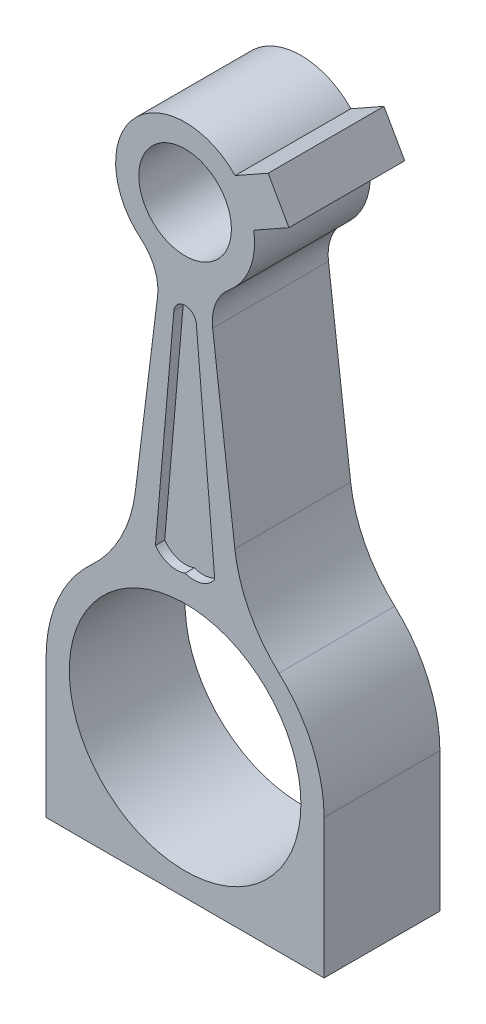
ISO-10303-21;
HEADER;
FILE_DESCRIPTION(('STEP AP214'),'2;1');
FILE_NAME('part.step','',(''),(''),'','','');
FILE_SCHEMA(('AUTOMOTIVE_DESIGN { 1 0 10303 214 1 1 1 1 }'));
ENDSEC;
DATA;
#1=APPLICATION_CONTEXT('core data for automotive mechanical design processes');
#2=APPLICATION_PROTOCOL_DEFINITION('international standard','automotive_design',2000,#1);
#3=PRODUCT_CONTEXT('',#1,'mechanical');
#4=PRODUCT('Part','Part','',(#3));
#5=PRODUCT_RELATED_PRODUCT_CATEGORY('part','',(#4));
#6=PRODUCT_DEFINITION_FORMATION('','',#4);
#7=PRODUCT_DEFINITION_CONTEXT('part definition',#1,'design');
#8=PRODUCT_DEFINITION('design','',#6,#7);
#9=PRODUCT_DEFINITION_SHAPE('','',#8);
#10=(LENGTH_UNIT() NAMED_UNIT(*) SI_UNIT(.MILLI.,.METRE.));
#11=(NAMED_UNIT(*) PLANE_ANGLE_UNIT() SI_UNIT($,.RADIAN.));
#12=(NAMED_UNIT(*) SI_UNIT($,.STERADIAN.) SOLID_ANGLE_UNIT());
#13=UNCERTAINTY_MEASURE_WITH_UNIT(LENGTH_MEASURE(1.E-05),#10,'distance_accuracy_value','');
#14=(GEOMETRIC_REPRESENTATION_CONTEXT(3) GLOBAL_UNCERTAINTY_ASSIGNED_CONTEXT((#13)) GLOBAL_UNIT_ASSIGNED_CONTEXT((#10,
#11,#12)) REPRESENTATION_CONTEXT('',''));
#15=CARTESIAN_POINT('',(0.,0.,0.));
#16=DIRECTION('',(0.,0.,1.));
#17=DIRECTION('',(1.,0.,0.));
#18=AXIS2_PLACEMENT_3D('',#15,#16,#17);
#19=CARTESIAN_POINT('',(-15.8746273797095,80.6868903188695,25.));
#20=DIRECTION('',(0.,0.,1.));
#21=DIRECTION('',(1.,0.,0.));
#22=AXIS2_PLACEMENT_3D('',#19,#20,#21);
#23=PLANE('',#22);
#24=CARTESIAN_POINT('',(0.,78.3083251410441,25.));
#25=DIRECTION('',(0.,0.,1.));
#26=DIRECTION('',(-1.,0.,0.));
#27=AXIS2_PLACEMENT_3D('',#24,#25,#26);
#28=CIRCLE('',#27,2.43314408957335);
#29=CARTESIAN_POINT('',(2.42401891172644,78.5188541799397,25.));
#30=VERTEX_POINT('',#29);
#31=CARTESIAN_POINT('',(-2.42401891172644,78.5188541799397,25.));
#32=VERTEX_POINT('',#31);
#33=EDGE_CURVE('E57',#30,#32,#28,.T.);
#34=ORIENTED_EDGE('',*,*,#33,.F.);
#35=DIRECTION('',(-0.0864803256849415,0.996253558723594,0.));
#36=VECTOR('',#35,1.);
#37=CARTESIAN_POINT('',(2.42401891172644,78.5188541799397,25.));
#38=LINE('',#37,#36);
#39=CARTESIAN_POINT('',(6.40336891240634,32.6767326547846,25.));
#40=VERTEX_POINT('',#39);
#41=EDGE_CURVE('E404',#40,#30,#38,.T.);
#42=ORIENTED_EDGE('',*,*,#41,.F.);
#43=CARTESIAN_POINT('',(1.88165049597591,35.9038191144411,25.));
#44=DIRECTION('',(0.,0.,1.));
#45=DIRECTION('',(-1.,0.,0.));
#46=AXIS2_PLACEMENT_3D('',#43,#44,#45);
#47=CIRCLE('',#46,5.55517996608433);
#48=CARTESIAN_POINT('',(0.,30.6770212547015,25.));
#49=VERTEX_POINT('',#48);
#50=EDGE_CURVE('E409',#49,#40,#47,.T.);
#51=ORIENTED_EDGE('',*,*,#50,.F.);
#52=CARTESIAN_POINT('',(-1.88165049597591,35.9038191144411,25.));
#53=DIRECTION('',(0.,0.,1.));
#54=DIRECTION('',(1.,0.,0.));
#55=AXIS2_PLACEMENT_3D('',#52,#53,#54);
#56=CIRCLE('',#55,5.55517996608433);
#57=CARTESIAN_POINT('',(-6.40336891240634,32.6767326547846,25.));
#58=VERTEX_POINT('',#57);
#59=EDGE_CURVE('E413',#58,#49,#56,.T.);
#60=ORIENTED_EDGE('',*,*,#59,.F.);
#61=DIRECTION('',(-0.0864803256849415,-0.996253558723594,0.));
#62=VECTOR('',#61,1.);
#63=CARTESIAN_POINT('',(-2.42401891172644,78.5188541799397,25.));
#64=LINE('',#63,#62);
#65=EDGE_CURVE('E417',#32,#58,#64,.T.);
#66=ORIENTED_EDGE('',*,*,#65,.F.);
#67=EDGE_LOOP('',(#34,#42,#51,#60,#66));
#68=FACE_BOUND('',#67,.T.);
#69=CARTESIAN_POINT('',(0.,0.,25.));
#70=DIRECTION('',(0.,0.,1.));
#71=DIRECTION('',(1.,0.,0.));
#72=AXIS2_PLACEMENT_3D('',#69,#70,#71);
#73=CIRCLE('',#72,25.);
#74=CARTESIAN_POINT('',(25.,0.,25.));
#75=VERTEX_POINT('',#74);
#76=EDGE_CURVE('E208',#75,#75,#73,.T.);
#77=ORIENTED_EDGE('',*,*,#76,.F.);
#78=EDGE_LOOP('',(#77));
#79=FACE_BOUND('',#78,.T.);
#80=CARTESIAN_POINT('',(-15.8746273797095,80.6868903188695,25.));
#81=DIRECTION('',(0.,0.,-1.));
#82=DIRECTION('',(1.,0.,0.));
#83=AXIS2_PLACEMENT_3D('',#80,#81,#82);
#84=CIRCLE('',#83,10.);
#85=CARTESIAN_POINT('',(-9.52477642782569,88.4121341913217,25.));
#86=VERTEX_POINT('',#85);
#87=CARTESIAN_POINT('',(-5.94956690013108,79.464935132821,25.));
#88=VERTEX_POINT('',#87);
#89=EDGE_CURVE('E251',#86,#88,#84,.T.);
#90=ORIENTED_EDGE('',*,*,#89,.T.);
#91=DIRECTION('',(-0.122195518604848,-0.992506047957841,0.));
#92=VECTOR('',#91,1.);
#93=CARTESIAN_POINT('',(-5.94956690013108,79.464935132821,25.));
#94=LINE('',#93,#92);
#95=CARTESIAN_POINT('',(-10.7353375612273,40.5935724223992,25.));
#96=VERTEX_POINT('',#95);
#97=EDGE_CURVE('E131',#88,#96,#94,.T.);
#98=ORIENTED_EDGE('',*,*,#97,.T.);
#99=CARTESIAN_POINT('',(-40.5105189999625,44.2594379805447,25.));
#100=DIRECTION('',(0.,0.,-1.));
#101=DIRECTION('',(-1.,0.,0.));
#102=AXIS2_PLACEMENT_3D('',#99,#100,#101);
#103=CIRCLE('',#102,30.);
#104=CARTESIAN_POINT('',(-20.2552594999812,22.1297189902723,25.));
#105=VERTEX_POINT('',#104);
#106=EDGE_CURVE('E304',#96,#105,#103,.T.);
#107=ORIENTED_EDGE('',*,*,#106,.T.);
#108=CARTESIAN_POINT('',(0.,0.,25.));
#109=DIRECTION('',(0.,0.,1.));
#110=DIRECTION('',(1.,0.,0.));
#111=AXIS2_PLACEMENT_3D('',#108,#109,#110);
#112=CIRCLE('',#111,30.);
#113=CARTESIAN_POINT('',(-30.,0.,25.));
#114=VERTEX_POINT('',#113);
#115=EDGE_CURVE('E324',#105,#114,#112,.T.);
#116=ORIENTED_EDGE('',*,*,#115,.T.);
#117=DIRECTION('',(0.,-1.,0.));
#118=VECTOR('',#117,1.);
#119=CARTESIAN_POINT('',(-30.,0.,25.));
#120=LINE('',#119,#118);
#121=CARTESIAN_POINT('',(-30.,-30.,25.));
#122=VERTEX_POINT('',#121);
#123=EDGE_CURVE('E320',#114,#122,#120,.T.);
#124=ORIENTED_EDGE('',*,*,#123,.T.);
#125=DIRECTION('',(1.,0.,0.));
#126=VECTOR('',#125,1.);
#127=CARTESIAN_POINT('',(-30.,-30.,25.));
#128=LINE('',#127,#126);
#129=CARTESIAN_POINT('',(30.,-30.,25.));
#130=VERTEX_POINT('',#129);
#131=EDGE_CURVE('E323',#122,#130,#128,.T.);
#132=ORIENTED_EDGE('',*,*,#131,.T.);
#133=DIRECTION('',(0.,1.,0.));
#134=VECTOR('',#133,1.);
#135=CARTESIAN_POINT('',(30.,0.,25.));
#136=LINE('',#135,#134);
#137=CARTESIAN_POINT('',(30.,0.,25.));
#138=VERTEX_POINT('',#137);
#139=EDGE_CURVE('E328',#130,#138,#136,.T.);
#140=ORIENTED_EDGE('',*,*,#139,.T.);
#141=CARTESIAN_POINT('',(0.,0.,25.));
#142=DIRECTION('',(0.,0.,1.));
#143=DIRECTION('',(1.,0.,0.));
#144=AXIS2_PLACEMENT_3D('',#141,#142,#143);
#145=CIRCLE('',#144,30.);
#146=CARTESIAN_POINT('',(20.2552594999812,22.1297189902723,25.));
#147=VERTEX_POINT('',#146);
#148=EDGE_CURVE('E335',#138,#147,#145,.T.);
#149=ORIENTED_EDGE('',*,*,#148,.T.);
#150=CARTESIAN_POINT('',(40.5105189999625,44.2594379805447,25.));
#151=DIRECTION('',(0.,0.,-1.));
#152=DIRECTION('',(1.,0.,0.));
#153=AXIS2_PLACEMENT_3D('',#150,#151,#152);
#154=CIRCLE('',#153,30.);
#155=CARTESIAN_POINT('',(10.7353375612273,40.5935724223992,25.));
#156=VERTEX_POINT('',#155);
#157=EDGE_CURVE('E338',#147,#156,#154,.T.);
#158=ORIENTED_EDGE('',*,*,#157,.T.);
#159=DIRECTION('',(-0.122195518604848,0.992506047957841,0.));
#160=VECTOR('',#159,1.);
#161=CARTESIAN_POINT('',(5.94956690013108,79.464935132821,25.));
#162=LINE('',#161,#160);
#163=CARTESIAN_POINT('',(5.94956690013108,79.464935132821,25.));
#164=VERTEX_POINT('',#163);
#165=EDGE_CURVE('E341',#156,#164,#162,.T.);
#166=ORIENTED_EDGE('',*,*,#165,.T.);
#167=CARTESIAN_POINT('',(15.8746273797095,80.6868903188695,25.));
#168=DIRECTION('',(0.,0.,-1.));
#169=DIRECTION('',(-1.,0.,0.));
#170=AXIS2_PLACEMENT_3D('',#167,#168,#169);
#171=CIRCLE('',#170,10.);
#172=CARTESIAN_POINT('',(9.5247764278257,88.4121341913217,25.));
#173=VERTEX_POINT('',#172);
#174=EDGE_CURVE('E344',#164,#173,#171,.T.);
#175=ORIENTED_EDGE('',*,*,#174,.T.);
#176=CARTESIAN_POINT('',(0.,100.,25.));
#177=DIRECTION('',(0.,0.,1.));
#178=DIRECTION('',(1.,0.,0.));
#179=AXIS2_PLACEMENT_3D('',#176,#177,#178);
#180=CIRCLE('',#179,15.);
#181=CARTESIAN_POINT('',(14.8348774028038,102.219552307062,25.));
#182=VERTEX_POINT('',#181);
#183=EDGE_CURVE('E347',#173,#182,#180,.T.);
#184=ORIENTED_EDGE('',*,*,#183,.T.);
#185=DIRECTION('',(0.871727655672724,0.489990708417349,0.));
#186=VECTOR('',#185,1.);
#187=CARTESIAN_POINT('',(14.8348774028038,102.219552307062,25.));
#188=LINE('',#187,#186);
#189=CARTESIAN_POINT('',(22.4152206320299,106.480398828065,25.));
#190=VERTEX_POINT('',#189);
#191=EDGE_CURVE('E178',#182,#190,#188,.T.);
#192=ORIENTED_EDGE('',*,*,#191,.T.);
#193=DIRECTION('',(-0.491013063369396,0.871152209203766,0.));
#194=VECTOR('',#193,1.);
#195=CARTESIAN_POINT('',(17.9356987556267,114.427937641038,25.));
#196=LINE('',#195,#194);
#197=CARTESIAN_POINT('',(17.9356987556267,114.427937641038,25.));
#198=VERTEX_POINT('',#197);
#199=EDGE_CURVE('E171',#190,#198,#196,.T.);
#200=ORIENTED_EDGE('',*,*,#199,.T.);
#201=DIRECTION('',(-0.871727655672725,-0.489990708417349,0.));
#202=VECTOR('',#201,1.);
#203=CARTESIAN_POINT('',(10.7953655760058,110.414417030271,25.));
#204=LINE('',#203,#202);
#205=CARTESIAN_POINT('',(10.7953655760058,110.414417030271,25.));
#206=VERTEX_POINT('',#205);
#207=EDGE_CURVE('E175',#198,#206,#204,.T.);
#208=ORIENTED_EDGE('',*,*,#207,.T.);
#209=CARTESIAN_POINT('',(0.,100.,25.));
#210=DIRECTION('',(0.,0.,1.));
#211=DIRECTION('',(1.,0.,0.));
#212=AXIS2_PLACEMENT_3D('',#209,#210,#211);
#213=CIRCLE('',#212,15.);
#214=EDGE_CURVE('E66',#206,#86,#213,.T.);
#215=ORIENTED_EDGE('',*,*,#214,.T.);
#216=EDGE_LOOP('',(#90,#98,#107,#116,#124,#132,#140,#149,#158,#166,#175,#184,#192,#200,#208,#215));
#217=FACE_BOUND('',#216,.T.);
#218=CARTESIAN_POINT('',(0.,100.,25.));
#219=DIRECTION('',(0.,0.,1.));
#220=DIRECTION('',(1.,0.,0.));
#221=AXIS2_PLACEMENT_3D('',#218,#219,#220);
#222=CIRCLE('',#221,10.);
#223=CARTESIAN_POINT('',(10.,100.,25.));
#224=VERTEX_POINT('',#223);
#225=EDGE_CURVE('E374',#224,#224,#222,.T.);
#226=ORIENTED_EDGE('',*,*,#225,.F.);
#227=EDGE_LOOP('',(#226));
#228=FACE_BOUND('',#227,.T.);
#229=ADVANCED_FACE('F41',(#68,#79,#217,#228),#23,.T.);
#230=CARTESIAN_POINT('',(-15.8746273797095,80.6868903188695,0.));
#231=DIRECTION('',(0.,0.,1.));
#232=DIRECTION('',(1.,0.,0.));
#233=AXIS2_PLACEMENT_3D('',#230,#231,#232);
#234=PLANE('',#233);
#235=CARTESIAN_POINT('',(-15.8746273797095,80.6868903188695,0.));
#236=DIRECTION('',(0.,0.,-1.));
#237=DIRECTION('',(1.,0.,0.));
#238=AXIS2_PLACEMENT_3D('',#235,#236,#237);
#239=CIRCLE('',#238,10.);
#240=CARTESIAN_POINT('',(-9.52477642782569,88.4121341913217,0.));
#241=VERTEX_POINT('',#240);
#242=CARTESIAN_POINT('',(-5.94956690013108,79.464935132821,0.));
#243=VERTEX_POINT('',#242);
#244=EDGE_CURVE('E203',#241,#243,#239,.T.);
#245=ORIENTED_EDGE('',*,*,#244,.F.);
#246=CARTESIAN_POINT('',(0.,100.,0.));
#247=DIRECTION('',(0.,0.,1.));
#248=DIRECTION('',(1.,0.,0.));
#249=AXIS2_PLACEMENT_3D('',#246,#247,#248);
#250=CIRCLE('',#249,15.);
#251=CARTESIAN_POINT('',(10.7953655760058,110.414417030271,0.));
#252=VERTEX_POINT('',#251);
#253=EDGE_CURVE('E123',#252,#241,#250,.T.);
#254=ORIENTED_EDGE('',*,*,#253,.F.);
#255=DIRECTION('',(-0.871727655672725,-0.489990708417349,0.));
#256=VECTOR('',#255,1.);
#257=CARTESIAN_POINT('',(10.7953655760058,110.414417030271,0.));
#258=LINE('',#257,#256);
#259=CARTESIAN_POINT('',(17.9356987556267,114.427937641038,0.));
#260=VERTEX_POINT('',#259);
#261=EDGE_CURVE('E246',#260,#252,#258,.T.);
#262=ORIENTED_EDGE('',*,*,#261,.F.);
#263=DIRECTION('',(-0.491013063369396,0.871152209203766,0.));
#264=VECTOR('',#263,1.);
#265=CARTESIAN_POINT('',(17.9356987556267,114.427937641038,0.));
#266=LINE('',#265,#264);
#267=CARTESIAN_POINT('',(22.4152206320299,106.480398828065,0.));
#268=VERTEX_POINT('',#267);
#269=EDGE_CURVE('E188',#268,#260,#266,.T.);
#270=ORIENTED_EDGE('',*,*,#269,.F.);
#271=DIRECTION('',(0.871727655672724,0.489990708417349,0.));
#272=VECTOR('',#271,1.);
#273=CARTESIAN_POINT('',(14.8348774028038,102.219552307062,0.));
#274=LINE('',#273,#272);
#275=CARTESIAN_POINT('',(14.8348774028038,102.219552307062,0.));
#276=VERTEX_POINT('',#275);
#277=EDGE_CURVE('E241',#276,#268,#274,.T.);
#278=ORIENTED_EDGE('',*,*,#277,.F.);
#279=CARTESIAN_POINT('',(0.,100.,0.));
#280=DIRECTION('',(0.,0.,1.));
#281=DIRECTION('',(1.,0.,0.));
#282=AXIS2_PLACEMENT_3D('',#279,#280,#281);
#283=CIRCLE('',#282,15.);
#284=CARTESIAN_POINT('',(9.5247764278257,88.4121341913217,0.));
#285=VERTEX_POINT('',#284);
#286=EDGE_CURVE('E238',#285,#276,#283,.T.);
#287=ORIENTED_EDGE('',*,*,#286,.F.);
#288=CARTESIAN_POINT('',(15.8746273797095,80.6868903188695,0.));
#289=DIRECTION('',(0.,0.,-1.));
#290=DIRECTION('',(-1.,0.,0.));
#291=AXIS2_PLACEMENT_3D('',#288,#289,#290);
#292=CIRCLE('',#291,10.);
#293=CARTESIAN_POINT('',(5.94956690013108,79.464935132821,0.));
#294=VERTEX_POINT('',#293);
#295=EDGE_CURVE('E235',#294,#285,#292,.T.);
#296=ORIENTED_EDGE('',*,*,#295,.F.);
#297=DIRECTION('',(-0.122195518604848,0.992506047957841,0.));
#298=VECTOR('',#297,1.);
#299=CARTESIAN_POINT('',(5.94956690013108,79.464935132821,0.));
#300=LINE('',#299,#298);
#301=CARTESIAN_POINT('',(10.7353375612273,40.5935724223992,0.));
#302=VERTEX_POINT('',#301);
#303=EDGE_CURVE('E232',#302,#294,#300,.T.);
#304=ORIENTED_EDGE('',*,*,#303,.F.);
#305=CARTESIAN_POINT('',(40.5105189999625,44.2594379805447,0.));
#306=DIRECTION('',(0.,0.,-1.));
#307=DIRECTION('',(1.,0.,0.));
#308=AXIS2_PLACEMENT_3D('',#305,#306,#307);
#309=CIRCLE('',#308,30.);
#310=CARTESIAN_POINT('',(20.2552594999812,22.1297189902723,0.));
#311=VERTEX_POINT('',#310);
#312=EDGE_CURVE('E229',#311,#302,#309,.T.);
#313=ORIENTED_EDGE('',*,*,#312,.F.);
#314=CARTESIAN_POINT('',(0.,0.,0.));
#315=DIRECTION('',(0.,0.,1.));
#316=DIRECTION('',(1.,0.,0.));
#317=AXIS2_PLACEMENT_3D('',#314,#315,#316);
#318=CIRCLE('',#317,30.);
#319=CARTESIAN_POINT('',(30.,0.,0.));
#320=VERTEX_POINT('',#319);
#321=EDGE_CURVE('E226',#320,#311,#318,.T.);
#322=ORIENTED_EDGE('',*,*,#321,.F.);
#323=DIRECTION('',(0.,1.,0.));
#324=VECTOR('',#323,1.);
#325=CARTESIAN_POINT('',(30.,0.,0.));
#326=LINE('',#325,#324);
#327=CARTESIAN_POINT('',(30.,-30.,0.));
#328=VERTEX_POINT('',#327);
#329=EDGE_CURVE('E223',#328,#320,#326,.T.);
#330=ORIENTED_EDGE('',*,*,#329,.F.);
#331=DIRECTION('',(1.,0.,0.));
#332=VECTOR('',#331,1.);
#333=CARTESIAN_POINT('',(-30.,-30.,0.));
#334=LINE('',#333,#332);
#335=CARTESIAN_POINT('',(-30.,-30.,0.));
#336=VERTEX_POINT('',#335);
#337=EDGE_CURVE('E220',#336,#328,#334,.T.);
#338=ORIENTED_EDGE('',*,*,#337,.F.);
#339=DIRECTION('',(0.,-1.,0.));
#340=VECTOR('',#339,1.);
#341=CARTESIAN_POINT('',(-30.,0.,0.));
#342=LINE('',#341,#340);
#343=CARTESIAN_POINT('',(-30.,0.,0.));
#344=VERTEX_POINT('',#343);
#345=EDGE_CURVE('E217',#344,#336,#342,.T.);
#346=ORIENTED_EDGE('',*,*,#345,.F.);
#347=CARTESIAN_POINT('',(0.,0.,0.));
#348=DIRECTION('',(0.,0.,1.));
#349=DIRECTION('',(1.,0.,0.));
#350=AXIS2_PLACEMENT_3D('',#347,#348,#349);
#351=CIRCLE('',#350,30.);
#352=CARTESIAN_POINT('',(-20.2552594999812,22.1297189902723,0.));
#353=VERTEX_POINT('',#352);
#354=EDGE_CURVE('E214',#353,#344,#351,.T.);
#355=ORIENTED_EDGE('',*,*,#354,.F.);
#356=CARTESIAN_POINT('',(-40.5105189999625,44.2594379805447,0.));
#357=DIRECTION('',(0.,0.,-1.));
#358=DIRECTION('',(-1.,0.,0.));
#359=AXIS2_PLACEMENT_3D('',#356,#357,#358);
#360=CIRCLE('',#359,30.);
#361=CARTESIAN_POINT('',(-10.7353375612273,40.5935724223992,0.));
#362=VERTEX_POINT('',#361);
#363=EDGE_CURVE('E211',#362,#353,#360,.T.);
#364=ORIENTED_EDGE('',*,*,#363,.F.);
#365=DIRECTION('',(-0.122195518604848,-0.992506047957841,0.));
#366=VECTOR('',#365,1.);
#367=CARTESIAN_POINT('',(-5.94956690013108,79.464935132821,0.));
#368=LINE('',#367,#366);
#369=EDGE_CURVE('E207',#243,#362,#368,.T.);
#370=ORIENTED_EDGE('',*,*,#369,.F.);
#371=EDGE_LOOP('',(#245,#254,#262,#270,#278,#287,#296,#304,#313,#322,#330,#338,#346,#355,#364,#370));
#372=FACE_BOUND('',#371,.T.);
#373=CARTESIAN_POINT('',(0.,0.,0.));
#374=DIRECTION('',(0.,0.,1.));
#375=DIRECTION('',(1.,0.,0.));
#376=AXIS2_PLACEMENT_3D('',#373,#374,#375);
#377=CIRCLE('',#376,25.);
#378=CARTESIAN_POINT('',(25.,0.,0.));
#379=VERTEX_POINT('',#378);
#380=EDGE_CURVE('E369',#379,#379,#377,.T.);
#381=ORIENTED_EDGE('',*,*,#380,.T.);
#382=EDGE_LOOP('',(#381));
#383=FACE_BOUND('',#382,.T.);
#384=CARTESIAN_POINT('',(0.,100.,0.));
#385=DIRECTION('',(0.,0.,1.));
#386=DIRECTION('',(1.,0.,0.));
#387=AXIS2_PLACEMENT_3D('',#384,#385,#386);
#388=CIRCLE('',#387,10.);
#389=CARTESIAN_POINT('',(10.,100.,0.));
#390=VERTEX_POINT('',#389);
#391=EDGE_CURVE('E378',#390,#390,#388,.T.);
#392=ORIENTED_EDGE('',*,*,#391,.T.);
#393=EDGE_LOOP('',(#392));
#394=FACE_BOUND('',#393,.T.);
#395=ADVANCED_FACE('F308',(#372,#383,#394),#234,.F.);
#396=CARTESIAN_POINT('',(-15.8746273797095,80.6868903188695,25.));
#397=DIRECTION('',(0.,0.,-1.));
#398=DIRECTION('',(-1.,0.,0.));
#399=AXIS2_PLACEMENT_3D('',#396,#397,#398);
#400=CYLINDRICAL_SURFACE('',#399,10.);
#401=ORIENTED_EDGE('',*,*,#244,.T.);
#402=DIRECTION('',(0.,0.,-1.));
#403=VECTOR('',#402,1.);
#404=CARTESIAN_POINT('',(-5.94956690013108,79.464935132821,25.));
#405=LINE('',#404,#403);
#406=EDGE_CURVE('E11',#88,#243,#405,.T.);
#407=ORIENTED_EDGE('',*,*,#406,.F.);
#408=ORIENTED_EDGE('',*,*,#89,.F.);
#409=DIRECTION('',(0.,0.,-1.));
#410=VECTOR('',#409,1.);
#411=CARTESIAN_POINT('',(-9.52477642782569,88.4121341913217,25.));
#412=LINE('',#411,#410);
#413=EDGE_CURVE('E199',#86,#241,#412,.T.);
#414=ORIENTED_EDGE('',*,*,#413,.T.);
#415=EDGE_LOOP('',(#401,#407,#408,#414));
#416=FACE_BOUND('',#415,.T.);
#417=ADVANCED_FACE('F43',(#416),#400,.F.);
#418=CARTESIAN_POINT('',(-5.94956690013108,79.464935132821,25.));
#419=DIRECTION('',(0.992506047957841,-0.122195518604848,0.));
#420=DIRECTION('',(0.122195518604848,0.992506047957841,0.));
#421=AXIS2_PLACEMENT_3D('',#418,#419,#420);
#422=PLANE('',#421);
#423=ORIENTED_EDGE('',*,*,#369,.T.);
#424=DIRECTION('',(0.,0.,-1.));
#425=VECTOR('',#424,1.);
#426=CARTESIAN_POINT('',(-10.7353375612273,40.5935724223992,25.));
#427=LINE('',#426,#425);
#428=EDGE_CURVE('E50',#96,#362,#427,.T.);
#429=ORIENTED_EDGE('',*,*,#428,.F.);
#430=ORIENTED_EDGE('',*,*,#97,.F.);
#431=ORIENTED_EDGE('',*,*,#406,.T.);
#432=EDGE_LOOP('',(#423,#429,#430,#431));
#433=FACE_BOUND('',#432,.T.);
#434=ADVANCED_FACE('F537',(#433),#422,.F.);
#435=CARTESIAN_POINT('',(-40.5105189999625,44.2594379805447,25.));
#436=DIRECTION('',(0.,0.,-1.));
#437=DIRECTION('',(-1.,0.,0.));
#438=AXIS2_PLACEMENT_3D('',#435,#436,#437);
#439=CYLINDRICAL_SURFACE('',#438,30.);
#440=ORIENTED_EDGE('',*,*,#363,.T.);
#441=DIRECTION('',(0.,0.,-1.));
#442=VECTOR('',#441,1.);
#443=CARTESIAN_POINT('',(-20.2552594999812,22.1297189902723,25.));
#444=LINE('',#443,#442);
#445=EDGE_CURVE('E294',#105,#353,#444,.T.);
#446=ORIENTED_EDGE('',*,*,#445,.F.);
#447=ORIENTED_EDGE('',*,*,#106,.F.);
#448=ORIENTED_EDGE('',*,*,#428,.T.);
#449=EDGE_LOOP('',(#440,#446,#447,#448));
#450=FACE_BOUND('',#449,.T.);
#451=ADVANCED_FACE('F302',(#450),#439,.F.);
#452=CARTESIAN_POINT('',(0.,0.,25.));
#453=DIRECTION('',(0.,0.,-1.));
#454=DIRECTION('',(-1.,0.,0.));
#455=AXIS2_PLACEMENT_3D('',#452,#453,#454);
#456=CYLINDRICAL_SURFACE('',#455,30.);
#457=ORIENTED_EDGE('',*,*,#354,.T.);
#458=DIRECTION('',(0.,0.,-1.));
#459=VECTOR('',#458,1.);
#460=CARTESIAN_POINT('',(-30.,0.,25.));
#461=LINE('',#460,#459);
#462=EDGE_CURVE('E290',#114,#344,#461,.T.);
#463=ORIENTED_EDGE('',*,*,#462,.F.);
#464=ORIENTED_EDGE('',*,*,#115,.F.);
#465=ORIENTED_EDGE('',*,*,#445,.T.);
#466=EDGE_LOOP('',(#457,#463,#464,#465));
#467=FACE_BOUND('',#466,.T.);
#468=ADVANCED_FACE('F314',(#467),#456,.T.);
#469=CARTESIAN_POINT('',(-30.,0.,25.));
#470=DIRECTION('',(1.,0.,0.));
#471=DIRECTION('',(0.,1.,0.));
#472=AXIS2_PLACEMENT_3D('',#469,#470,#471);
#473=PLANE('',#472);
#474=ORIENTED_EDGE('',*,*,#345,.T.);
#475=DIRECTION('',(0.,0.,-1.));
#476=VECTOR('',#475,1.);
#477=CARTESIAN_POINT('',(-30.,-30.,25.));
#478=LINE('',#477,#476);
#479=EDGE_CURVE('E286',#122,#336,#478,.T.);
#480=ORIENTED_EDGE('',*,*,#479,.F.);
#481=ORIENTED_EDGE('',*,*,#123,.F.);
#482=ORIENTED_EDGE('',*,*,#462,.T.);
#483=EDGE_LOOP('',(#474,#480,#481,#482));
#484=FACE_BOUND('',#483,.T.);
#485=ADVANCED_FACE('F318',(#484),#473,.F.);
#486=CARTESIAN_POINT('',(-30.,-30.,25.));
#487=DIRECTION('',(0.,1.,0.));
#488=DIRECTION('',(0.,0.,1.));
#489=AXIS2_PLACEMENT_3D('',#486,#487,#488);
#490=PLANE('',#489);
#491=ORIENTED_EDGE('',*,*,#337,.T.);
#492=DIRECTION('',(0.,0.,-1.));
#493=VECTOR('',#492,1.);
#494=CARTESIAN_POINT('',(30.,-30.,25.));
#495=LINE('',#494,#493);
#496=EDGE_CURVE('E282',#130,#328,#495,.T.);
#497=ORIENTED_EDGE('',*,*,#496,.F.);
#498=ORIENTED_EDGE('',*,*,#131,.F.);
#499=ORIENTED_EDGE('',*,*,#479,.T.);
#500=EDGE_LOOP('',(#491,#497,#498,#499));
#501=FACE_BOUND('',#500,.T.);
#502=ADVANCED_FACE('F527',(#501),#490,.F.);
#503=CARTESIAN_POINT('',(30.,0.,25.));
#504=DIRECTION('',(-1.,0.,0.));
#505=DIRECTION('',(0.,-1.,0.));
#506=AXIS2_PLACEMENT_3D('',#503,#504,#505);
#507=PLANE('',#506);
#508=ORIENTED_EDGE('',*,*,#329,.T.);
#509=DIRECTION('',(0.,0.,-1.));
#510=VECTOR('',#509,1.);
#511=CARTESIAN_POINT('',(30.,0.,25.));
#512=LINE('',#511,#510);
#513=EDGE_CURVE('E278',#138,#320,#512,.T.);
#514=ORIENTED_EDGE('',*,*,#513,.F.);
#515=ORIENTED_EDGE('',*,*,#139,.F.);
#516=ORIENTED_EDGE('',*,*,#496,.T.);
#517=EDGE_LOOP('',(#508,#514,#515,#516));
#518=FACE_BOUND('',#517,.T.);
#519=ADVANCED_FACE('F523',(#518),#507,.F.);
#520=CARTESIAN_POINT('',(0.,0.,25.));
#521=DIRECTION('',(0.,0.,-1.));
#522=DIRECTION('',(-1.,0.,0.));
#523=AXIS2_PLACEMENT_3D('',#520,#521,#522);
#524=CYLINDRICAL_SURFACE('',#523,30.);
#525=ORIENTED_EDGE('',*,*,#321,.T.);
#526=DIRECTION('',(0.,0.,-1.));
#527=VECTOR('',#526,1.);
#528=CARTESIAN_POINT('',(20.2552594999812,22.1297189902723,25.));
#529=LINE('',#528,#527);
#530=EDGE_CURVE('E274',#147,#311,#529,.T.);
#531=ORIENTED_EDGE('',*,*,#530,.F.);
#532=ORIENTED_EDGE('',*,*,#148,.F.);
#533=ORIENTED_EDGE('',*,*,#513,.T.);
#534=EDGE_LOOP('',(#525,#531,#532,#533));
#535=FACE_BOUND('',#534,.T.);
#536=ADVANCED_FACE('F519',(#535),#524,.T.);
#537=CARTESIAN_POINT('',(40.5105189999625,44.2594379805447,25.));
#538=DIRECTION('',(0.,0.,-1.));
#539=DIRECTION('',(-1.,0.,0.));
#540=AXIS2_PLACEMENT_3D('',#537,#538,#539);
#541=CYLINDRICAL_SURFACE('',#540,30.);
#542=ORIENTED_EDGE('',*,*,#312,.T.);
#543=DIRECTION('',(0.,0.,-1.));
#544=VECTOR('',#543,1.);
#545=CARTESIAN_POINT('',(10.7353375612273,40.5935724223992,25.));
#546=LINE('',#545,#544);
#547=EDGE_CURVE('E270',#156,#302,#546,.T.);
#548=ORIENTED_EDGE('',*,*,#547,.F.);
#549=ORIENTED_EDGE('',*,*,#157,.F.);
#550=ORIENTED_EDGE('',*,*,#530,.T.);
#551=EDGE_LOOP('',(#542,#548,#549,#550));
#552=FACE_BOUND('',#551,.T.);
#553=ADVANCED_FACE('F515',(#552),#541,.F.);
#554=CARTESIAN_POINT('',(5.94956690013108,79.464935132821,25.));
#555=DIRECTION('',(-0.992506047957841,-0.122195518604848,0.));
#556=DIRECTION('',(0.122195518604848,-0.992506047957841,0.));
#557=AXIS2_PLACEMENT_3D('',#554,#555,#556);
#558=PLANE('',#557);
#559=ORIENTED_EDGE('',*,*,#303,.T.);
#560=DIRECTION('',(0.,0.,-1.));
#561=VECTOR('',#560,1.);
#562=CARTESIAN_POINT('',(5.94956690013108,79.464935132821,25.));
#563=LINE('',#562,#561);
#564=EDGE_CURVE('E266',#164,#294,#563,.T.);
#565=ORIENTED_EDGE('',*,*,#564,.F.);
#566=ORIENTED_EDGE('',*,*,#165,.F.);
#567=ORIENTED_EDGE('',*,*,#547,.T.);
#568=EDGE_LOOP('',(#559,#565,#566,#567));
#569=FACE_BOUND('',#568,.T.);
#570=ADVANCED_FACE('F511',(#569),#558,.F.);
#571=CARTESIAN_POINT('',(15.8746273797095,80.6868903188695,25.));
#572=DIRECTION('',(0.,0.,-1.));
#573=DIRECTION('',(-1.,0.,0.));
#574=AXIS2_PLACEMENT_3D('',#571,#572,#573);
#575=CYLINDRICAL_SURFACE('',#574,10.);
#576=ORIENTED_EDGE('',*,*,#295,.T.);
#577=DIRECTION('',(0.,0.,-1.));
#578=VECTOR('',#577,1.);
#579=CARTESIAN_POINT('',(9.5247764278257,88.4121341913217,25.));
#580=LINE('',#579,#578);
#581=EDGE_CURVE('E262',#173,#285,#580,.T.);
#582=ORIENTED_EDGE('',*,*,#581,.F.);
#583=ORIENTED_EDGE('',*,*,#174,.F.);
#584=ORIENTED_EDGE('',*,*,#564,.T.);
#585=EDGE_LOOP('',(#576,#582,#583,#584));
#586=FACE_BOUND('',#585,.T.);
#587=ADVANCED_FACE('F508',(#586),#575,.F.);
#588=CARTESIAN_POINT('',(0.,100.,25.));
#589=DIRECTION('',(0.,0.,-1.));
#590=DIRECTION('',(-1.,0.,0.));
#591=AXIS2_PLACEMENT_3D('',#588,#589,#590);
#592=CYLINDRICAL_SURFACE('',#591,15.);
#593=ORIENTED_EDGE('',*,*,#286,.T.);
#594=DIRECTION('',(0.,0.,-1.));
#595=VECTOR('',#594,1.);
#596=CARTESIAN_POINT('',(14.8348774028038,102.219552307062,25.));
#597=LINE('',#596,#595);
#598=EDGE_CURVE('E258',#182,#276,#597,.T.);
#599=ORIENTED_EDGE('',*,*,#598,.F.);
#600=ORIENTED_EDGE('',*,*,#183,.F.);
#601=ORIENTED_EDGE('',*,*,#581,.T.);
#602=EDGE_LOOP('',(#593,#599,#600,#601));
#603=FACE_BOUND('',#602,.T.);
#604=ADVANCED_FACE('F355',(#603),#592,.T.);
#605=CARTESIAN_POINT('',(14.8348774028038,102.219552307062,25.));
#606=DIRECTION('',(-0.489990708417349,0.871727655672724,0.));
#607=DIRECTION('',(-0.871727655672725,-0.489990708417349,0.));
#608=AXIS2_PLACEMENT_3D('',#605,#606,#607);
#609=PLANE('',#608);
#610=ORIENTED_EDGE('',*,*,#277,.T.);
#611=DIRECTION('',(0.,0.,-1.));
#612=VECTOR('',#611,1.);
#613=CARTESIAN_POINT('',(22.4152206320299,106.480398828065,25.));
#614=LINE('',#613,#612);
#615=EDGE_CURVE('E192',#190,#268,#614,.T.);
#616=ORIENTED_EDGE('',*,*,#615,.F.);
#617=ORIENTED_EDGE('',*,*,#191,.F.);
#618=ORIENTED_EDGE('',*,*,#598,.T.);
#619=EDGE_LOOP('',(#610,#616,#617,#618));
#620=FACE_BOUND('',#619,.T.);
#621=ADVANCED_FACE('F359',(#620),#609,.F.);
#622=CARTESIAN_POINT('',(17.9356987556267,114.427937641038,25.));
#623=DIRECTION('',(-0.871152209203766,-0.491013063369396,0.));
#624=DIRECTION('',(0.491013063369396,-0.871152209203766,0.));
#625=AXIS2_PLACEMENT_3D('',#622,#623,#624);
#626=PLANE('',#625);
#627=ORIENTED_EDGE('',*,*,#269,.T.);
#628=DIRECTION('',(0.,0.,-1.));
#629=VECTOR('',#628,1.);
#630=CARTESIAN_POINT('',(17.9356987556267,114.427937641038,25.));
#631=LINE('',#630,#629);
#632=EDGE_CURVE('E185',#198,#260,#631,.T.);
#633=ORIENTED_EDGE('',*,*,#632,.F.);
#634=ORIENTED_EDGE('',*,*,#199,.F.);
#635=ORIENTED_EDGE('',*,*,#615,.T.);
#636=EDGE_LOOP('',(#627,#633,#634,#635));
#637=FACE_BOUND('',#636,.T.);
#638=ADVANCED_FACE('F186',(#637),#626,.F.);
#639=CARTESIAN_POINT('',(10.7953655760058,110.414417030271,25.));
#640=DIRECTION('',(0.489990708417349,-0.871727655672725,0.));
#641=DIRECTION('',(0.871727655672725,0.489990708417349,0.));
#642=AXIS2_PLACEMENT_3D('',#639,#640,#641);
#643=PLANE('',#642);
#644=ORIENTED_EDGE('',*,*,#261,.T.);
#645=DIRECTION('',(0.,0.,-1.));
#646=VECTOR('',#645,1.);
#647=CARTESIAN_POINT('',(10.7953655760058,110.414417030271,25.));
#648=LINE('',#647,#646);
#649=EDGE_CURVE('E193',#206,#252,#648,.T.);
#650=ORIENTED_EDGE('',*,*,#649,.F.);
#651=ORIENTED_EDGE('',*,*,#207,.F.);
#652=ORIENTED_EDGE('',*,*,#632,.T.);
#653=EDGE_LOOP('',(#644,#650,#651,#652));
#654=FACE_BOUND('',#653,.T.);
#655=ADVANCED_FACE('F195',(#654),#643,.F.);
#656=CARTESIAN_POINT('',(0.,100.,25.));
#657=DIRECTION('',(0.,0.,-1.));
#658=DIRECTION('',(-1.,0.,0.));
#659=AXIS2_PLACEMENT_3D('',#656,#657,#658);
#660=CYLINDRICAL_SURFACE('',#659,15.);
#661=ORIENTED_EDGE('',*,*,#253,.T.);
#662=ORIENTED_EDGE('',*,*,#413,.F.);
#663=ORIENTED_EDGE('',*,*,#214,.F.);
#664=ORIENTED_EDGE('',*,*,#649,.T.);
#665=EDGE_LOOP('',(#661,#662,#663,#664));
#666=FACE_BOUND('',#665,.T.);
#667=ADVANCED_FACE('F360',(#666),#660,.T.);
#668=CARTESIAN_POINT('',(0.,0.,25.));
#669=DIRECTION('',(0.,0.,-1.));
#670=DIRECTION('',(-1.,0.,0.));
#671=AXIS2_PLACEMENT_3D('',#668,#669,#670);
#672=CYLINDRICAL_SURFACE('',#671,25.);
#673=ORIENTED_EDGE('',*,*,#76,.T.);
#674=EDGE_LOOP('',(#673));
#675=FACE_BOUND('',#674,.T.);
#676=ORIENTED_EDGE('',*,*,#380,.F.);
#677=EDGE_LOOP('',(#676));
#678=FACE_BOUND('',#677,.T.);
#679=ADVANCED_FACE('F495',(#675,#678),#672,.F.);
#680=CARTESIAN_POINT('',(0.,100.,25.));
#681=DIRECTION('',(0.,0.,-1.));
#682=DIRECTION('',(-1.,0.,0.));
#683=AXIS2_PLACEMENT_3D('',#680,#681,#682);
#684=CYLINDRICAL_SURFACE('',#683,10.);
#685=ORIENTED_EDGE('',*,*,#225,.T.);
#686=EDGE_LOOP('',(#685));
#687=FACE_BOUND('',#686,.T.);
#688=ORIENTED_EDGE('',*,*,#391,.F.);
#689=EDGE_LOOP('',(#688));
#690=FACE_BOUND('',#689,.T.);
#691=ADVANCED_FACE('F637',(#687,#690),#684,.F.);
#692=CARTESIAN_POINT('',(0.,78.3083251410441,23.));
#693=DIRECTION('',(0.,0.,1.));
#694=DIRECTION('',(1.,0.,0.));
#695=AXIS2_PLACEMENT_3D('',#692,#693,#694);
#696=CYLINDRICAL_SURFACE('',#695,2.43314408957335);
#697=ORIENTED_EDGE('',*,*,#33,.T.);
#698=DIRECTION('',(0.,0.,1.));
#699=VECTOR('',#698,1.);
#700=CARTESIAN_POINT('',(-2.42401891172644,78.5188541799397,23.));
#701=LINE('',#700,#699);
#702=CARTESIAN_POINT('',(-2.42401891172644,78.5188541799397,23.));
#703=VERTEX_POINT('',#702);
#704=EDGE_CURVE('E386',#703,#32,#701,.T.);
#705=ORIENTED_EDGE('',*,*,#704,.F.);
#706=CARTESIAN_POINT('',(0.,78.3083251410441,23.));
#707=DIRECTION('',(0.,0.,1.));
#708=DIRECTION('',(-1.,0.,0.));
#709=AXIS2_PLACEMENT_3D('',#706,#707,#708);
#710=CIRCLE('',#709,2.43314408957335);
#711=CARTESIAN_POINT('',(2.42401891172644,78.5188541799397,23.));
#712=VERTEX_POINT('',#711);
#713=EDGE_CURVE('E408',#712,#703,#710,.T.);
#714=ORIENTED_EDGE('',*,*,#713,.F.);
#715=DIRECTION('',(0.,0.,1.));
#716=VECTOR('',#715,1.);
#717=CARTESIAN_POINT('',(2.42401891172644,78.5188541799397,23.));
#718=LINE('',#717,#716);
#719=EDGE_CURVE('E382',#712,#30,#718,.T.);
#720=ORIENTED_EDGE('',*,*,#719,.T.);
#721=EDGE_LOOP('',(#697,#705,#714,#720));
#722=FACE_BOUND('',#721,.T.);
#723=ADVANCED_FACE('F448',(#722),#696,.F.);
#724=CARTESIAN_POINT('',(2.42401891172644,78.5188541799397,23.));
#725=DIRECTION('',(0.996253558723594,0.0864803256849416,0.));
#726=DIRECTION('',(-0.0864803256849416,0.996253558723594,0.));
#727=AXIS2_PLACEMENT_3D('',#724,#725,#726);
#728=PLANE('',#727);
#729=ORIENTED_EDGE('',*,*,#41,.T.);
#730=ORIENTED_EDGE('',*,*,#719,.F.);
#731=DIRECTION('',(-0.0864803256849415,0.996253558723594,0.));
#732=VECTOR('',#731,1.);
#733=CARTESIAN_POINT('',(2.42401891172644,78.5188541799397,23.));
#734=LINE('',#733,#732);
#735=CARTESIAN_POINT('',(6.40336891240634,32.6767326547846,23.));
#736=VERTEX_POINT('',#735);
#737=EDGE_CURVE('E390',#736,#712,#734,.T.);
#738=ORIENTED_EDGE('',*,*,#737,.F.);
#739=DIRECTION('',(0.,0.,1.));
#740=VECTOR('',#739,1.);
#741=CARTESIAN_POINT('',(6.40336891240634,32.6767326547846,23.));
#742=LINE('',#741,#740);
#743=EDGE_CURVE('E398',#736,#40,#742,.T.);
#744=ORIENTED_EDGE('',*,*,#743,.T.);
#745=EDGE_LOOP('',(#729,#730,#738,#744));
#746=FACE_BOUND('',#745,.T.);
#747=ADVANCED_FACE('F462',(#746),#728,.F.);
#748=CARTESIAN_POINT('',(1.88165049597591,35.9038191144411,23.));
#749=DIRECTION('',(0.,0.,1.));
#750=DIRECTION('',(1.,0.,0.));
#751=AXIS2_PLACEMENT_3D('',#748,#749,#750);
#752=CYLINDRICAL_SURFACE('',#751,5.55517996608433);
#753=ORIENTED_EDGE('',*,*,#50,.T.);
#754=ORIENTED_EDGE('',*,*,#743,.F.);
#755=CARTESIAN_POINT('',(1.88165049597591,35.9038191144411,23.));
#756=DIRECTION('',(0.,0.,1.));
#757=DIRECTION('',(-1.,0.,0.));
#758=AXIS2_PLACEMENT_3D('',#755,#756,#757);
#759=CIRCLE('',#758,5.55517996608433);
#760=CARTESIAN_POINT('',(0.,30.6770212547015,23.));
#761=VERTEX_POINT('',#760);
#762=EDGE_CURVE('E426',#761,#736,#759,.T.);
#763=ORIENTED_EDGE('',*,*,#762,.F.);
#764=DIRECTION('',(0.,0.,1.));
#765=VECTOR('',#764,1.);
#766=CARTESIAN_POINT('',(0.,30.6770212547015,23.));
#767=LINE('',#766,#765);
#768=EDGE_CURVE('E394',#761,#49,#767,.T.);
#769=ORIENTED_EDGE('',*,*,#768,.T.);
#770=EDGE_LOOP('',(#753,#754,#763,#769));
#771=FACE_BOUND('',#770,.T.);
#772=ADVANCED_FACE('F467',(#771),#752,.F.);
#773=CARTESIAN_POINT('',(-1.88165049597591,35.9038191144411,23.));
#774=DIRECTION('',(0.,0.,1.));
#775=DIRECTION('',(1.,0.,0.));
#776=AXIS2_PLACEMENT_3D('',#773,#774,#775);
#777=CYLINDRICAL_SURFACE('',#776,5.55517996608433);
#778=ORIENTED_EDGE('',*,*,#59,.T.);
#779=ORIENTED_EDGE('',*,*,#768,.F.);
#780=CARTESIAN_POINT('',(-1.88165049597591,35.9038191144411,23.));
#781=DIRECTION('',(0.,0.,1.));
#782=DIRECTION('',(1.,0.,0.));
#783=AXIS2_PLACEMENT_3D('',#780,#781,#782);
#784=CIRCLE('',#783,5.55517996608433);
#785=CARTESIAN_POINT('',(-6.40336891240634,32.6767326547846,23.));
#786=VERTEX_POINT('',#785);
#787=EDGE_CURVE('E430',#786,#761,#784,.T.);
#788=ORIENTED_EDGE('',*,*,#787,.F.);
#789=DIRECTION('',(0.,0.,1.));
#790=VECTOR('',#789,1.);
#791=CARTESIAN_POINT('',(-6.40336891240634,32.6767326547846,23.));
#792=LINE('',#791,#790);
#793=EDGE_CURVE('E389',#786,#58,#792,.T.);
#794=ORIENTED_EDGE('',*,*,#793,.T.);
#795=EDGE_LOOP('',(#778,#779,#788,#794));
#796=FACE_BOUND('',#795,.T.);
#797=ADVANCED_FACE('F479',(#796),#777,.F.);
#798=CARTESIAN_POINT('',(-2.42401891172644,78.5188541799397,23.));
#799=DIRECTION('',(-0.996253558723594,0.0864803256849416,0.));
#800=DIRECTION('',(-0.0864803256849416,-0.996253558723594,0.));
#801=AXIS2_PLACEMENT_3D('',#798,#799,#800);
#802=PLANE('',#801);
#803=ORIENTED_EDGE('',*,*,#65,.T.);
#804=ORIENTED_EDGE('',*,*,#793,.F.);
#805=DIRECTION('',(-0.0864803256849415,-0.996253558723594,0.));
#806=VECTOR('',#805,1.);
#807=CARTESIAN_POINT('',(-2.42401891172644,78.5188541799397,23.));
#808=LINE('',#807,#806);
#809=EDGE_CURVE('E434',#703,#786,#808,.T.);
#810=ORIENTED_EDGE('',*,*,#809,.F.);
#811=ORIENTED_EDGE('',*,*,#704,.T.);
#812=EDGE_LOOP('',(#803,#804,#810,#811));
#813=FACE_BOUND('',#812,.T.);
#814=ADVANCED_FACE('F475',(#813),#802,.F.);
#815=CARTESIAN_POINT('',(0.,78.3083251410441,23.));
#816=DIRECTION('',(0.,0.,-1.));
#817=DIRECTION('',(-1.,0.,0.));
#818=AXIS2_PLACEMENT_3D('',#815,#816,#817);
#819=PLANE('',#818);
#820=ORIENTED_EDGE('',*,*,#713,.T.);
#821=ORIENTED_EDGE('',*,*,#809,.T.);
#822=ORIENTED_EDGE('',*,*,#787,.T.);
#823=ORIENTED_EDGE('',*,*,#762,.T.);
#824=ORIENTED_EDGE('',*,*,#737,.T.);
#825=EDGE_LOOP('',(#820,#821,#822,#823,#824));
#826=FACE_BOUND('',#825,.T.);
#827=ADVANCED_FACE('F443',(#826),#819,.F.);
#828=CLOSED_SHELL('',(#229,#395,#417,#434,#451,#468,#485,#502,#519,#536,#553,#570,#587,#604,
#621,#638,#655,#667,#679,#691,#723,#747,#772,#797,#814,#827));
#829=MANIFOLD_SOLID_BREP('B2',#828);
#830=ADVANCED_BREP_SHAPE_REPRESENTATION('',(#18,#829),#14);
#831=SHAPE_DEFINITION_REPRESENTATION(#9,#830);
ENDSEC;
END-ISO-10303-21;
